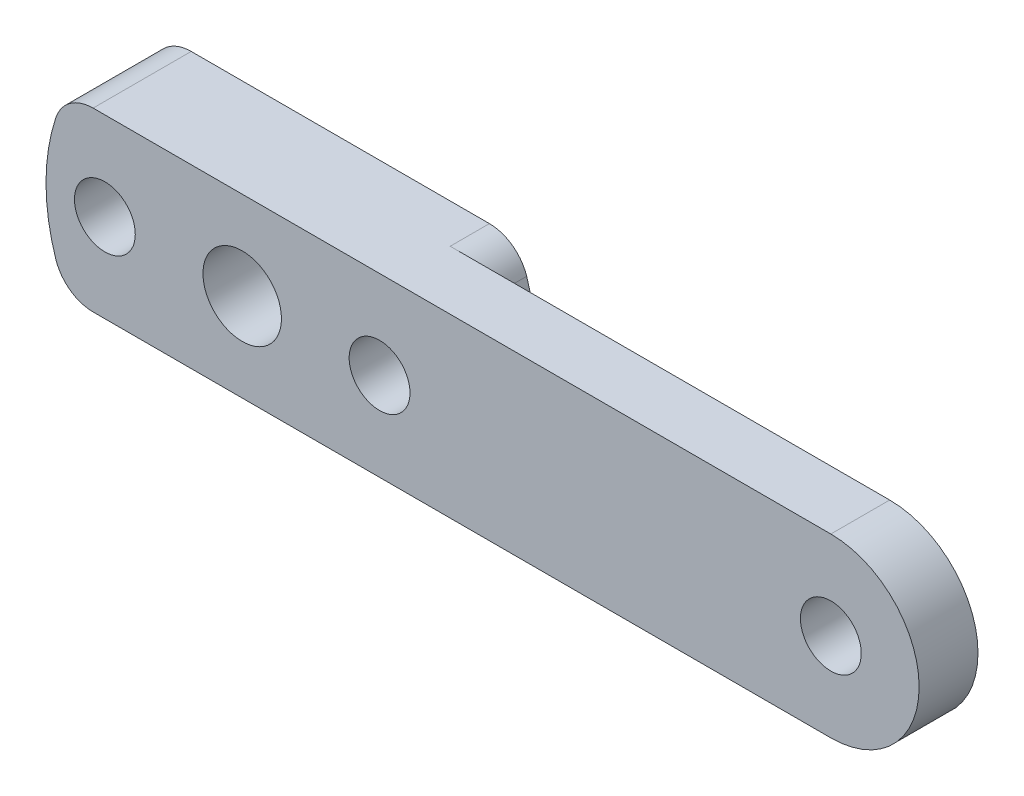
ISO-10303-21;
HEADER;
FILE_DESCRIPTION(('STEP AP214'),'2;1');
FILE_NAME('part.step','',(''),(''),'','','');
FILE_SCHEMA(('AUTOMOTIVE_DESIGN { 1 0 10303 214 1 1 1 1 }'));
ENDSEC;
DATA;
#1=APPLICATION_CONTEXT('core data for automotive mechanical design processes');
#2=APPLICATION_PROTOCOL_DEFINITION('international standard','automotive_design',2000,#1);
#3=PRODUCT_CONTEXT('',#1,'mechanical');
#4=PRODUCT('Part','Part','',(#3));
#5=PRODUCT_RELATED_PRODUCT_CATEGORY('part','',(#4));
#6=PRODUCT_DEFINITION_FORMATION('','',#4);
#7=PRODUCT_DEFINITION_CONTEXT('part definition',#1,'design');
#8=PRODUCT_DEFINITION('design','',#6,#7);
#9=PRODUCT_DEFINITION_SHAPE('','',#8);
#10=(LENGTH_UNIT() NAMED_UNIT(*) SI_UNIT(.MILLI.,.METRE.));
#11=(NAMED_UNIT(*) PLANE_ANGLE_UNIT() SI_UNIT($,.RADIAN.));
#12=(NAMED_UNIT(*) SI_UNIT($,.STERADIAN.) SOLID_ANGLE_UNIT());
#13=UNCERTAINTY_MEASURE_WITH_UNIT(LENGTH_MEASURE(1.E-05),#10,'distance_accuracy_value','');
#14=(GEOMETRIC_REPRESENTATION_CONTEXT(3) GLOBAL_UNCERTAINTY_ASSIGNED_CONTEXT((#13)) GLOBAL_UNIT_ASSIGNED_CONTEXT((#10,
#11,#12)) REPRESENTATION_CONTEXT('',''));
#15=CARTESIAN_POINT('',(0.,0.,0.));
#16=DIRECTION('',(0.,0.,1.));
#17=DIRECTION('',(1.,0.,0.));
#18=AXIS2_PLACEMENT_3D('',#15,#16,#17);
#19=CARTESIAN_POINT('',(30.,0.,2.5));
#20=DIRECTION('',(0.,0.,-1.));
#21=DIRECTION('',(-1.,0.,0.));
#22=AXIS2_PLACEMENT_3D('',#19,#20,#21);
#23=CYLINDRICAL_SURFACE('',#22,4.5);
#24=CARTESIAN_POINT('',(30.,0.,-0.5));
#25=DIRECTION('',(0.,0.,-1.));
#26=DIRECTION('',(-1.,0.,0.));
#27=AXIS2_PLACEMENT_3D('',#24,#25,#26);
#28=CIRCLE('',#27,4.5);
#29=CARTESIAN_POINT('',(30.,-4.49999999999999,-0.5));
#30=VERTEX_POINT('',#29);
#31=CARTESIAN_POINT('',(30.,4.5,-0.5));
#32=VERTEX_POINT('',#31);
#33=EDGE_CURVE('E118',#30,#32,#28,.F.);
#34=ORIENTED_EDGE('',*,*,#33,.T.);
#35=DIRECTION('',(0.,0.,-1.));
#36=VECTOR('',#35,1.);
#37=CARTESIAN_POINT('',(30.,4.5,2.5));
#38=LINE('',#37,#36);
#39=CARTESIAN_POINT('',(30.,4.5,2.5));
#40=VERTEX_POINT('',#39);
#41=EDGE_CURVE('E143',#40,#32,#38,.T.);
#42=ORIENTED_EDGE('',*,*,#41,.F.);
#43=CARTESIAN_POINT('',(30.,0.,2.5));
#44=DIRECTION('',(0.,0.,1.));
#45=DIRECTION('',(-1.,0.,0.));
#46=AXIS2_PLACEMENT_3D('',#43,#44,#45);
#47=CIRCLE('',#46,4.5);
#48=CARTESIAN_POINT('',(30.,-4.49999999999999,2.5));
#49=VERTEX_POINT('',#48);
#50=EDGE_CURVE('E141',#49,#40,#47,.T.);
#51=ORIENTED_EDGE('',*,*,#50,.F.);
#52=DIRECTION('',(0.,0.,-1.));
#53=VECTOR('',#52,1.);
#54=CARTESIAN_POINT('',(30.,-4.49999999999999,2.5));
#55=LINE('',#54,#53);
#56=EDGE_CURVE('E134',#49,#30,#55,.T.);
#57=ORIENTED_EDGE('',*,*,#56,.T.);
#58=EDGE_LOOP('',(#34,#42,#51,#57));
#59=FACE_BOUND('',#58,.T.);
#60=ADVANCED_FACE('F40',(#59),#23,.T.);
#61=CARTESIAN_POINT('',(30.,0.,2.5));
#62=DIRECTION('',(0.,0.,-1.));
#63=DIRECTION('',(-1.,0.,0.));
#64=AXIS2_PLACEMENT_3D('',#61,#62,#63);
#65=CYLINDRICAL_SURFACE('',#64,1.55);
#66=CARTESIAN_POINT('',(30.,0.,2.5));
#67=DIRECTION('',(0.,0.,1.));
#68=DIRECTION('',(1.,0.,0.));
#69=AXIS2_PLACEMENT_3D('',#66,#67,#68);
#70=CIRCLE('',#69,1.55);
#71=CARTESIAN_POINT('',(31.55,0.,2.5));
#72=VERTEX_POINT('',#71);
#73=EDGE_CURVE('E152',#72,#72,#70,.T.);
#74=ORIENTED_EDGE('',*,*,#73,.T.);
#75=EDGE_LOOP('',(#74));
#76=FACE_BOUND('',#75,.T.);
#77=CARTESIAN_POINT('',(30.,0.,-0.5));
#78=DIRECTION('',(0.,0.,-1.));
#79=DIRECTION('',(-1.,0.,0.));
#80=AXIS2_PLACEMENT_3D('',#77,#78,#79);
#81=CIRCLE('',#80,1.55);
#82=CARTESIAN_POINT('',(28.45,0.,-0.5));
#83=VERTEX_POINT('',#82);
#84=EDGE_CURVE('E139',#83,#83,#81,.T.);
#85=ORIENTED_EDGE('',*,*,#84,.T.);
#86=EDGE_LOOP('',(#85));
#87=FACE_BOUND('',#86,.T.);
#88=ADVANCED_FACE('F250',(#76,#87),#65,.F.);
#89=CARTESIAN_POINT('',(0.,0.,2.5));
#90=DIRECTION('',(0.,0.,-1.));
#91=DIRECTION('',(-1.,0.,0.));
#92=AXIS2_PLACEMENT_3D('',#89,#90,#91);
#93=PLANE('',#92);
#94=CARTESIAN_POINT('',(0.,0.,2.5));
#95=DIRECTION('',(0.,0.,1.));
#96=DIRECTION('',(-1.,0.,0.));
#97=AXIS2_PLACEMENT_3D('',#94,#95,#96);
#98=CIRCLE('',#97,10.);
#99=CARTESIAN_POINT('',(-9.49917759598166,3.125,2.5));
#100=VERTEX_POINT('',#99);
#101=CARTESIAN_POINT('',(-9.49917759598166,-3.125,2.5));
#102=VERTEX_POINT('',#101);
#103=EDGE_CURVE('E203',#100,#102,#98,.T.);
#104=ORIENTED_EDGE('',*,*,#103,.T.);
#105=CARTESIAN_POINT('',(-7.59934207678533,-2.5,2.5));
#106=DIRECTION('',(0.,0.,-1.));
#107=DIRECTION('',(-1.,0.,0.));
#108=AXIS2_PLACEMENT_3D('',#105,#106,#107);
#109=CIRCLE('',#108,2.);
#110=CARTESIAN_POINT('',(-7.59934207678533,-4.5,2.5));
#111=VERTEX_POINT('',#110);
#112=EDGE_CURVE('E178',#102,#111,#109,.F.);
#113=ORIENTED_EDGE('',*,*,#112,.T.);
#114=DIRECTION('',(1.,0.,0.));
#115=VECTOR('',#114,1.);
#116=CARTESIAN_POINT('',(30.,-4.49999999999999,2.5));
#117=LINE('',#116,#115);
#118=EDGE_CURVE('E209',#111,#49,#117,.T.);
#119=ORIENTED_EDGE('',*,*,#118,.T.);
#120=ORIENTED_EDGE('',*,*,#50,.T.);
#121=DIRECTION('',(-1.,0.,0.));
#122=VECTOR('',#121,1.);
#123=CARTESIAN_POINT('',(-8.93028554974588,4.5,2.5));
#124=LINE('',#123,#122);
#125=CARTESIAN_POINT('',(-7.59934207678533,4.5,2.5));
#126=VERTEX_POINT('',#125);
#127=EDGE_CURVE('E147',#40,#126,#124,.T.);
#128=ORIENTED_EDGE('',*,*,#127,.T.);
#129=CARTESIAN_POINT('',(-7.59934207678533,2.5,2.5));
#130=DIRECTION('',(0.,0.,-1.));
#131=DIRECTION('',(-1.,0.,0.));
#132=AXIS2_PLACEMENT_3D('',#129,#130,#131);
#133=CIRCLE('',#132,2.);
#134=EDGE_CURVE('E62',#126,#100,#133,.F.);
#135=ORIENTED_EDGE('',*,*,#134,.T.);
#136=EDGE_LOOP('',(#104,#113,#119,#120,#128,#135));
#137=FACE_BOUND('',#136,.T.);
#138=CARTESIAN_POINT('',(-7.,0.,2.5));
#139=DIRECTION('',(0.,0.,1.));
#140=DIRECTION('',(1.,0.,0.));
#141=AXIS2_PLACEMENT_3D('',#138,#139,#140);
#142=CIRCLE('',#141,1.55);
#143=CARTESIAN_POINT('',(-5.45,0.,2.5));
#144=VERTEX_POINT('',#143);
#145=EDGE_CURVE('E204',#144,#144,#142,.T.);
#146=ORIENTED_EDGE('',*,*,#145,.F.);
#147=EDGE_LOOP('',(#146));
#148=FACE_BOUND('',#147,.T.);
#149=CARTESIAN_POINT('',(7.,0.,2.5));
#150=DIRECTION('',(0.,0.,1.));
#151=DIRECTION('',(1.,0.,0.));
#152=AXIS2_PLACEMENT_3D('',#149,#150,#151);
#153=CIRCLE('',#152,1.55);
#154=CARTESIAN_POINT('',(8.55,0.,2.5));
#155=VERTEX_POINT('',#154);
#156=EDGE_CURVE('E215',#155,#155,#153,.T.);
#157=ORIENTED_EDGE('',*,*,#156,.F.);
#158=EDGE_LOOP('',(#157));
#159=FACE_BOUND('',#158,.T.);
#160=CARTESIAN_POINT('',(0.,0.,2.5));
#161=DIRECTION('',(0.,0.,1.));
#162=DIRECTION('',(1.,0.,0.));
#163=AXIS2_PLACEMENT_3D('',#160,#161,#162);
#164=CIRCLE('',#163,2.);
#165=CARTESIAN_POINT('',(2.,0.,2.5));
#166=VERTEX_POINT('',#165);
#167=EDGE_CURVE('E221',#166,#166,#164,.T.);
#168=ORIENTED_EDGE('',*,*,#167,.F.);
#169=EDGE_LOOP('',(#168));
#170=FACE_BOUND('',#169,.T.);
#171=ORIENTED_EDGE('',*,*,#73,.F.);
#172=EDGE_LOOP('',(#171));
#173=FACE_BOUND('',#172,.T.);
#174=ADVANCED_FACE('F247',(#137,#148,#159,#170,#173),#93,.F.);
#175=CARTESIAN_POINT('',(0.,0.,-2.5));
#176=DIRECTION('',(0.,0.,-1.));
#177=DIRECTION('',(-1.,0.,0.));
#178=AXIS2_PLACEMENT_3D('',#175,#176,#177);
#179=PLANE('',#178);
#180=CARTESIAN_POINT('',(0.,0.,-2.5));
#181=DIRECTION('',(0.,0.,1.));
#182=DIRECTION('',(1.,0.,0.));
#183=AXIS2_PLACEMENT_3D('',#180,#181,#182);
#184=CIRCLE('',#183,9.99999999999999);
#185=CARTESIAN_POINT('',(9.49917759598166,-3.125,-2.5));
#186=VERTEX_POINT('',#185);
#187=CARTESIAN_POINT('',(9.49917759598166,3.125,-2.5));
#188=VERTEX_POINT('',#187);
#189=EDGE_CURVE('E190',#186,#188,#184,.T.);
#190=ORIENTED_EDGE('',*,*,#189,.F.);
#191=CARTESIAN_POINT('',(7.59934207678533,-2.5,-2.5));
#192=DIRECTION('',(0.,0.,-1.));
#193=DIRECTION('',(-1.,0.,0.));
#194=AXIS2_PLACEMENT_3D('',#191,#192,#193);
#195=CIRCLE('',#194,2.);
#196=CARTESIAN_POINT('',(7.59934207678533,-4.5,-2.5));
#197=VERTEX_POINT('',#196);
#198=EDGE_CURVE('E162',#186,#197,#195,.T.);
#199=ORIENTED_EDGE('',*,*,#198,.T.);
#200=DIRECTION('',(1.,0.,0.));
#201=VECTOR('',#200,1.);
#202=CARTESIAN_POINT('',(30.,-4.49999999999999,-2.5));
#203=LINE('',#202,#201);
#204=CARTESIAN_POINT('',(-7.59934207678533,-4.5,-2.5));
#205=VERTEX_POINT('',#204);
#206=EDGE_CURVE('E197',#205,#197,#203,.T.);
#207=ORIENTED_EDGE('',*,*,#206,.F.);
#208=CARTESIAN_POINT('',(-7.59934207678533,-2.5,-2.5));
#209=DIRECTION('',(0.,0.,-1.));
#210=DIRECTION('',(-1.,0.,0.));
#211=AXIS2_PLACEMENT_3D('',#208,#209,#210);
#212=CIRCLE('',#211,2.);
#213=CARTESIAN_POINT('',(-9.49917759598166,-3.125,-2.5));
#214=VERTEX_POINT('',#213);
#215=EDGE_CURVE('E158',#205,#214,#212,.T.);
#216=ORIENTED_EDGE('',*,*,#215,.T.);
#217=CARTESIAN_POINT('',(0.,0.,-2.5));
#218=DIRECTION('',(0.,0.,1.));
#219=DIRECTION('',(-1.,0.,0.));
#220=AXIS2_PLACEMENT_3D('',#217,#218,#219);
#221=CIRCLE('',#220,10.);
#222=CARTESIAN_POINT('',(-9.49917759598166,3.125,-2.5));
#223=VERTEX_POINT('',#222);
#224=EDGE_CURVE('E200',#223,#214,#221,.T.);
#225=ORIENTED_EDGE('',*,*,#224,.F.);
#226=CARTESIAN_POINT('',(-7.59934207678533,2.5,-2.5));
#227=DIRECTION('',(0.,0.,-1.));
#228=DIRECTION('',(-1.,0.,0.));
#229=AXIS2_PLACEMENT_3D('',#226,#227,#228);
#230=CIRCLE('',#229,2.);
#231=CARTESIAN_POINT('',(-7.59934207678533,4.5,-2.5));
#232=VERTEX_POINT('',#231);
#233=EDGE_CURVE('E156',#223,#232,#230,.T.);
#234=ORIENTED_EDGE('',*,*,#233,.T.);
#235=DIRECTION('',(-1.,0.,0.));
#236=VECTOR('',#235,1.);
#237=CARTESIAN_POINT('',(-8.93028554974588,4.5,-2.5));
#238=LINE('',#237,#236);
#239=CARTESIAN_POINT('',(7.59934207678533,4.5,-2.5));
#240=VERTEX_POINT('',#239);
#241=EDGE_CURVE('E199',#240,#232,#238,.T.);
#242=ORIENTED_EDGE('',*,*,#241,.F.);
#243=CARTESIAN_POINT('',(7.59934207678533,2.5,-2.5));
#244=DIRECTION('',(0.,0.,-1.));
#245=DIRECTION('',(-1.,0.,0.));
#246=AXIS2_PLACEMENT_3D('',#243,#244,#245);
#247=CIRCLE('',#246,2.);
#248=EDGE_CURVE('E160',#240,#188,#247,.T.);
#249=ORIENTED_EDGE('',*,*,#248,.T.);
#250=EDGE_LOOP('',(#190,#199,#207,#216,#225,#234,#242,#249));
#251=FACE_BOUND('',#250,.T.);
#252=CARTESIAN_POINT('',(0.,0.,-2.5));
#253=DIRECTION('',(0.,0.,1.));
#254=DIRECTION('',(1.,0.,0.));
#255=AXIS2_PLACEMENT_3D('',#252,#253,#254);
#256=CIRCLE('',#255,2.);
#257=CARTESIAN_POINT('',(2.,0.,-2.5));
#258=VERTEX_POINT('',#257);
#259=EDGE_CURVE('E224',#258,#258,#256,.T.);
#260=ORIENTED_EDGE('',*,*,#259,.T.);
#261=EDGE_LOOP('',(#260));
#262=FACE_BOUND('',#261,.T.);
#263=CARTESIAN_POINT('',(-7.,0.,-2.5));
#264=DIRECTION('',(0.,0.,1.));
#265=DIRECTION('',(1.,0.,0.));
#266=AXIS2_PLACEMENT_3D('',#263,#264,#265);
#267=CIRCLE('',#266,1.55);
#268=CARTESIAN_POINT('',(-5.45,0.,-2.5));
#269=VERTEX_POINT('',#268);
#270=EDGE_CURVE('E212',#269,#269,#267,.T.);
#271=ORIENTED_EDGE('',*,*,#270,.T.);
#272=EDGE_LOOP('',(#271));
#273=FACE_BOUND('',#272,.T.);
#274=CARTESIAN_POINT('',(7.,0.,-2.5));
#275=DIRECTION('',(0.,0.,1.));
#276=DIRECTION('',(1.,0.,0.));
#277=AXIS2_PLACEMENT_3D('',#274,#275,#276);
#278=CIRCLE('',#277,1.55);
#279=CARTESIAN_POINT('',(8.55,0.,-2.5));
#280=VERTEX_POINT('',#279);
#281=EDGE_CURVE('E218',#280,#280,#278,.T.);
#282=ORIENTED_EDGE('',*,*,#281,.T.);
#283=EDGE_LOOP('',(#282));
#284=FACE_BOUND('',#283,.T.);
#285=ADVANCED_FACE('F195',(#251,#262,#273,#284),#179,.T.);
#286=CARTESIAN_POINT('',(0.,0.,2.5));
#287=DIRECTION('',(0.,0.,-1.));
#288=DIRECTION('',(-1.,0.,0.));
#289=AXIS2_PLACEMENT_3D('',#286,#287,#288);
#290=CYLINDRICAL_SURFACE('',#289,10.);
#291=ORIENTED_EDGE('',*,*,#224,.T.);
#292=DIRECTION('',(0.,0.,-1.));
#293=VECTOR('',#292,1.);
#294=CARTESIAN_POINT('',(-9.49917759598166,-3.125,2.5));
#295=LINE('',#294,#293);
#296=EDGE_CURVE('E55',#214,#102,#295,.F.);
#297=ORIENTED_EDGE('',*,*,#296,.T.);
#298=ORIENTED_EDGE('',*,*,#103,.F.);
#299=DIRECTION('',(0.,0.,-1.));
#300=VECTOR('',#299,1.);
#301=CARTESIAN_POINT('',(-9.49917759598166,3.125,2.5));
#302=LINE('',#301,#300);
#303=EDGE_CURVE('E173',#100,#223,#302,.T.);
#304=ORIENTED_EDGE('',*,*,#303,.T.);
#305=EDGE_LOOP('',(#291,#297,#298,#304));
#306=FACE_BOUND('',#305,.T.);
#307=ADVANCED_FACE('F243',(#306),#290,.T.);
#308=CARTESIAN_POINT('',(30.,-4.49999999999999,2.5));
#309=DIRECTION('',(0.,1.,0.));
#310=DIRECTION('',(-1.,0.,0.));
#311=AXIS2_PLACEMENT_3D('',#308,#309,#310);
#312=PLANE('',#311);
#313=ORIENTED_EDGE('',*,*,#206,.T.);
#314=DIRECTION('',(0.,0.,-1.));
#315=VECTOR('',#314,1.);
#316=CARTESIAN_POINT('',(7.59934207678533,-4.5,2.5));
#317=LINE('',#316,#315);
#318=CARTESIAN_POINT('',(7.59934207678533,-4.50000000000001,-0.5));
#319=VERTEX_POINT('',#318);
#320=EDGE_CURVE('E137',#197,#319,#317,.F.);
#321=ORIENTED_EDGE('',*,*,#320,.T.);
#322=DIRECTION('',(1.,0.,0.));
#323=VECTOR('',#322,1.);
#324=CARTESIAN_POINT('',(8.93028554974588,-4.50000000000001,-0.5));
#325=LINE('',#324,#323);
#326=EDGE_CURVE('E121',#319,#30,#325,.T.);
#327=ORIENTED_EDGE('',*,*,#326,.T.);
#328=ORIENTED_EDGE('',*,*,#56,.F.);
#329=ORIENTED_EDGE('',*,*,#118,.F.);
#330=DIRECTION('',(0.,0.,-1.));
#331=VECTOR('',#330,1.);
#332=CARTESIAN_POINT('',(-7.59934207678533,-4.5,2.5));
#333=LINE('',#332,#331);
#334=EDGE_CURVE('E164',#111,#205,#333,.T.);
#335=ORIENTED_EDGE('',*,*,#334,.T.);
#336=EDGE_LOOP('',(#313,#321,#327,#328,#329,#335));
#337=FACE_BOUND('',#336,.T.);
#338=ADVANCED_FACE('F132',(#337),#312,.F.);
#339=CARTESIAN_POINT('',(-8.93028554974588,4.5,2.5));
#340=DIRECTION('',(0.,-1.,0.));
#341=DIRECTION('',(1.,0.,0.));
#342=AXIS2_PLACEMENT_3D('',#339,#340,#341);
#343=PLANE('',#342);
#344=DIRECTION('',(-1.,0.,0.));
#345=VECTOR('',#344,1.);
#346=CARTESIAN_POINT('',(30.,4.5,-0.5));
#347=LINE('',#346,#345);
#348=CARTESIAN_POINT('',(7.59934207678533,4.5,-0.5));
#349=VERTEX_POINT('',#348);
#350=EDGE_CURVE('E123',#32,#349,#347,.T.);
#351=ORIENTED_EDGE('',*,*,#350,.T.);
#352=DIRECTION('',(0.,0.,-1.));
#353=VECTOR('',#352,1.);
#354=CARTESIAN_POINT('',(7.59934207678533,4.5,2.5));
#355=LINE('',#354,#353);
#356=EDGE_CURVE('E170',#349,#240,#355,.T.);
#357=ORIENTED_EDGE('',*,*,#356,.T.);
#358=ORIENTED_EDGE('',*,*,#241,.T.);
#359=DIRECTION('',(0.,0.,-1.));
#360=VECTOR('',#359,1.);
#361=CARTESIAN_POINT('',(-7.59934207678533,4.5,2.5));
#362=LINE('',#361,#360);
#363=EDGE_CURVE('E168',#232,#126,#362,.F.);
#364=ORIENTED_EDGE('',*,*,#363,.T.);
#365=ORIENTED_EDGE('',*,*,#127,.F.);
#366=ORIENTED_EDGE('',*,*,#41,.T.);
#367=EDGE_LOOP('',(#351,#357,#358,#364,#365,#366));
#368=FACE_BOUND('',#367,.T.);
#369=ADVANCED_FACE('F233',(#368),#343,.F.);
#370=CARTESIAN_POINT('',(-7.,0.,2.5));
#371=DIRECTION('',(0.,0.,-1.));
#372=DIRECTION('',(-1.,0.,0.));
#373=AXIS2_PLACEMENT_3D('',#370,#371,#372);
#374=CYLINDRICAL_SURFACE('',#373,1.55);
#375=ORIENTED_EDGE('',*,*,#145,.T.);
#376=EDGE_LOOP('',(#375));
#377=FACE_BOUND('',#376,.T.);
#378=ORIENTED_EDGE('',*,*,#270,.F.);
#379=EDGE_LOOP('',(#378));
#380=FACE_BOUND('',#379,.T.);
#381=ADVANCED_FACE('F335',(#377,#380),#374,.F.);
#382=CARTESIAN_POINT('',(7.,0.,2.5));
#383=DIRECTION('',(0.,0.,-1.));
#384=DIRECTION('',(-1.,0.,0.));
#385=AXIS2_PLACEMENT_3D('',#382,#383,#384);
#386=CYLINDRICAL_SURFACE('',#385,1.55);
#387=ORIENTED_EDGE('',*,*,#156,.T.);
#388=EDGE_LOOP('',(#387));
#389=FACE_BOUND('',#388,.T.);
#390=ORIENTED_EDGE('',*,*,#281,.F.);
#391=EDGE_LOOP('',(#390));
#392=FACE_BOUND('',#391,.T.);
#393=ADVANCED_FACE('F384',(#389,#392),#386,.F.);
#394=CARTESIAN_POINT('',(0.,0.,2.5));
#395=DIRECTION('',(0.,0.,-1.));
#396=DIRECTION('',(-1.,0.,0.));
#397=AXIS2_PLACEMENT_3D('',#394,#395,#396);
#398=CYLINDRICAL_SURFACE('',#397,2.);
#399=ORIENTED_EDGE('',*,*,#167,.T.);
#400=EDGE_LOOP('',(#399));
#401=FACE_BOUND('',#400,.T.);
#402=ORIENTED_EDGE('',*,*,#259,.F.);
#403=EDGE_LOOP('',(#402));
#404=FACE_BOUND('',#403,.T.);
#405=ADVANCED_FACE('F272',(#401,#404),#398,.F.);
#406=CARTESIAN_POINT('',(0.,0.,29.6073845486343));
#407=DIRECTION('',(0.,0.,-1.));
#408=DIRECTION('',(-1.,0.,0.));
#409=AXIS2_PLACEMENT_3D('',#406,#407,#408);
#410=CYLINDRICAL_SURFACE('',#409,9.99999999999999);
#411=CARTESIAN_POINT('',(0.,0.,-0.5));
#412=DIRECTION('',(0.,0.,-1.));
#413=DIRECTION('',(-1.,0.,0.));
#414=AXIS2_PLACEMENT_3D('',#411,#412,#413);
#415=CIRCLE('',#414,9.99999999999999);
#416=CARTESIAN_POINT('',(9.49917759598166,3.125,-0.5));
#417=VERTEX_POINT('',#416);
#418=CARTESIAN_POINT('',(9.49917759598166,-3.125,-0.5));
#419=VERTEX_POINT('',#418);
#420=EDGE_CURVE('E181',#417,#419,#415,.T.);
#421=ORIENTED_EDGE('',*,*,#420,.T.);
#422=DIRECTION('',(0.,0.,-1.));
#423=VECTOR('',#422,1.);
#424=CARTESIAN_POINT('',(9.49917759598166,-3.125,29.6073845486343));
#425=LINE('',#424,#423);
#426=EDGE_CURVE('E145',#419,#186,#425,.T.);
#427=ORIENTED_EDGE('',*,*,#426,.T.);
#428=ORIENTED_EDGE('',*,*,#189,.T.);
#429=DIRECTION('',(0.,0.,-1.));
#430=VECTOR('',#429,1.);
#431=CARTESIAN_POINT('',(9.49917759598166,3.125,29.6073845486343));
#432=LINE('',#431,#430);
#433=EDGE_CURVE('E142',#188,#417,#432,.F.);
#434=ORIENTED_EDGE('',*,*,#433,.T.);
#435=EDGE_LOOP('',(#421,#427,#428,#434));
#436=FACE_BOUND('',#435,.T.);
#437=ADVANCED_FACE('F186',(#436),#410,.T.);
#438=CARTESIAN_POINT('',(0.,0.,-0.5));
#439=DIRECTION('',(0.,0.,-1.));
#440=DIRECTION('',(-1.,0.,0.));
#441=AXIS2_PLACEMENT_3D('',#438,#439,#440);
#442=PLANE('',#441);
#443=ORIENTED_EDGE('',*,*,#84,.F.);
#444=EDGE_LOOP('',(#443));
#445=FACE_BOUND('',#444,.T.);
#446=ORIENTED_EDGE('',*,*,#33,.F.);
#447=ORIENTED_EDGE('',*,*,#326,.F.);
#448=CARTESIAN_POINT('',(7.59934207678533,-2.5,-0.5));
#449=DIRECTION('',(0.,0.,-1.));
#450=DIRECTION('',(-1.,0.,0.));
#451=AXIS2_PLACEMENT_3D('',#448,#449,#450);
#452=CIRCLE('',#451,2.);
#453=EDGE_CURVE('E48',#319,#419,#452,.F.);
#454=ORIENTED_EDGE('',*,*,#453,.T.);
#455=ORIENTED_EDGE('',*,*,#420,.F.);
#456=CARTESIAN_POINT('',(7.59934207678533,2.5,-0.5));
#457=DIRECTION('',(0.,0.,-1.));
#458=DIRECTION('',(-1.,0.,0.));
#459=AXIS2_PLACEMENT_3D('',#456,#457,#458);
#460=CIRCLE('',#459,2.);
#461=EDGE_CURVE('E12',#417,#349,#460,.F.);
#462=ORIENTED_EDGE('',*,*,#461,.T.);
#463=ORIENTED_EDGE('',*,*,#350,.F.);
#464=EDGE_LOOP('',(#446,#447,#454,#455,#462,#463));
#465=FACE_BOUND('',#464,.T.);
#466=ADVANCED_FACE('F120',(#445,#465),#442,.T.);
#467=CARTESIAN_POINT('',(7.59934207678533,-2.5,29.6073845486343));
#468=DIRECTION('',(0.,0.,-1.));
#469=DIRECTION('',(-1.,0.,0.));
#470=AXIS2_PLACEMENT_3D('',#467,#468,#469);
#471=CYLINDRICAL_SURFACE('',#470,2.);
#472=ORIENTED_EDGE('',*,*,#453,.F.);
#473=ORIENTED_EDGE('',*,*,#320,.F.);
#474=ORIENTED_EDGE('',*,*,#198,.F.);
#475=ORIENTED_EDGE('',*,*,#426,.F.);
#476=EDGE_LOOP('',(#472,#473,#474,#475));
#477=FACE_BOUND('',#476,.T.);
#478=ADVANCED_FACE('F192',(#477),#471,.T.);
#479=CARTESIAN_POINT('',(7.59934207678533,2.5,29.6073845486343));
#480=DIRECTION('',(0.,0.,-1.));
#481=DIRECTION('',(-1.,0.,0.));
#482=AXIS2_PLACEMENT_3D('',#479,#480,#481);
#483=CYLINDRICAL_SURFACE('',#482,2.);
#484=ORIENTED_EDGE('',*,*,#461,.F.);
#485=ORIENTED_EDGE('',*,*,#433,.F.);
#486=ORIENTED_EDGE('',*,*,#248,.F.);
#487=ORIENTED_EDGE('',*,*,#356,.F.);
#488=EDGE_LOOP('',(#484,#485,#486,#487));
#489=FACE_BOUND('',#488,.T.);
#490=ADVANCED_FACE('F238',(#489),#483,.T.);
#491=CARTESIAN_POINT('',(-7.59934207678533,-2.5,2.5));
#492=DIRECTION('',(0.,0.,-1.));
#493=DIRECTION('',(-1.,0.,0.));
#494=AXIS2_PLACEMENT_3D('',#491,#492,#493);
#495=CYLINDRICAL_SURFACE('',#494,2.);
#496=ORIENTED_EDGE('',*,*,#112,.F.);
#497=ORIENTED_EDGE('',*,*,#296,.F.);
#498=ORIENTED_EDGE('',*,*,#215,.F.);
#499=ORIENTED_EDGE('',*,*,#334,.F.);
#500=EDGE_LOOP('',(#496,#497,#498,#499));
#501=FACE_BOUND('',#500,.T.);
#502=ADVANCED_FACE('F246',(#501),#495,.T.);
#503=CARTESIAN_POINT('',(-7.59934207678533,2.5,2.5));
#504=DIRECTION('',(0.,0.,-1.));
#505=DIRECTION('',(-1.,0.,0.));
#506=AXIS2_PLACEMENT_3D('',#503,#504,#505);
#507=CYLINDRICAL_SURFACE('',#506,2.);
#508=ORIENTED_EDGE('',*,*,#134,.F.);
#509=ORIENTED_EDGE('',*,*,#363,.F.);
#510=ORIENTED_EDGE('',*,*,#233,.F.);
#511=ORIENTED_EDGE('',*,*,#303,.F.);
#512=EDGE_LOOP('',(#508,#509,#510,#511));
#513=FACE_BOUND('',#512,.T.);
#514=ADVANCED_FACE('F42',(#513),#507,.T.);
#515=CLOSED_SHELL('',(#60,#88,#174,#285,#307,#338,#369,#381,#393,#405,#437,#466,#478,#490,#502,#514));
#516=MANIFOLD_SOLID_BREP('B2',#515);
#517=ADVANCED_BREP_SHAPE_REPRESENTATION('',(#18,#516),#14);
#518=SHAPE_DEFINITION_REPRESENTATION(#9,#517);
ENDSEC;
END-ISO-10303-21;
